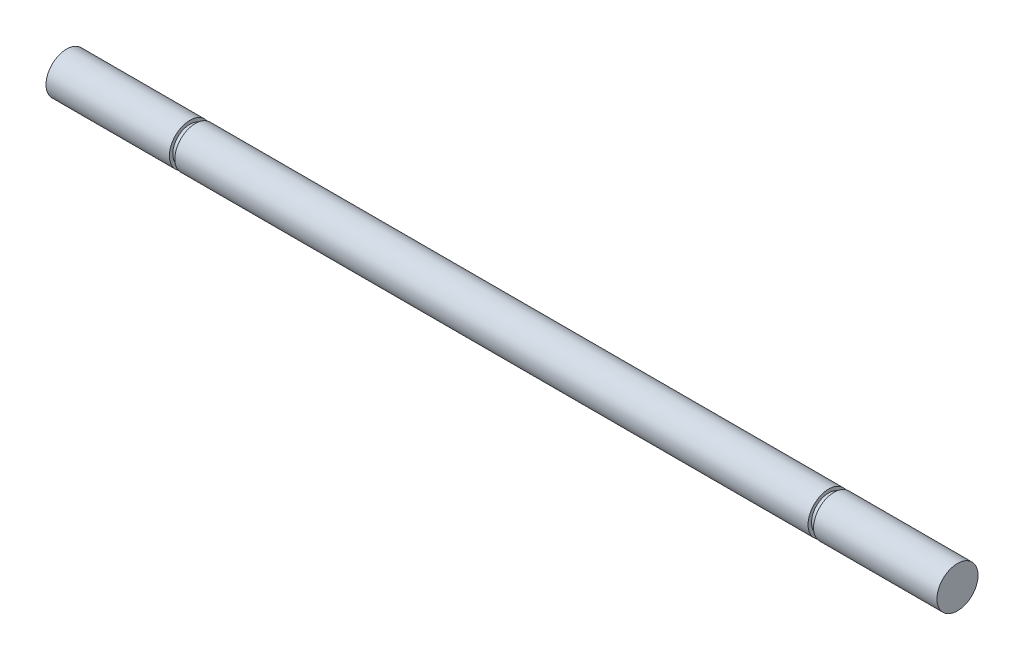
ISO-10303-21;
HEADER;
FILE_DESCRIPTION(('STEP AP214'),'2;1');
FILE_NAME('part.step','',(''),(''),'','','');
FILE_SCHEMA(('AUTOMOTIVE_DESIGN { 1 0 10303 214 1 1 1 1 }'));
ENDSEC;
DATA;
#1=APPLICATION_CONTEXT('core data for automotive mechanical design processes');
#2=APPLICATION_PROTOCOL_DEFINITION('international standard','automotive_design',2000,#1);
#3=PRODUCT_CONTEXT('',#1,'mechanical');
#4=PRODUCT('Part','Part','',(#3));
#5=PRODUCT_RELATED_PRODUCT_CATEGORY('part','',(#4));
#6=PRODUCT_DEFINITION_FORMATION('','',#4);
#7=PRODUCT_DEFINITION_CONTEXT('part definition',#1,'design');
#8=PRODUCT_DEFINITION('design','',#6,#7);
#9=PRODUCT_DEFINITION_SHAPE('','',#8);
#10=(LENGTH_UNIT() NAMED_UNIT(*) SI_UNIT(.MILLI.,.METRE.));
#11=(NAMED_UNIT(*) PLANE_ANGLE_UNIT() SI_UNIT($,.RADIAN.));
#12=(NAMED_UNIT(*) SI_UNIT($,.STERADIAN.) SOLID_ANGLE_UNIT());
#13=UNCERTAINTY_MEASURE_WITH_UNIT(LENGTH_MEASURE(1.E-05),#10,'distance_accuracy_value','');
#14=(GEOMETRIC_REPRESENTATION_CONTEXT(3) GLOBAL_UNCERTAINTY_ASSIGNED_CONTEXT((#13)) GLOBAL_UNIT_ASSIGNED_CONTEXT((#10,
#11,#12)) REPRESENTATION_CONTEXT('',''));
#15=CARTESIAN_POINT('',(0.,0.,0.));
#16=DIRECTION('',(0.,0.,1.));
#17=DIRECTION('',(1.,0.,0.));
#18=AXIS2_PLACEMENT_3D('',#15,#16,#17);
#19=CARTESIAN_POINT('',(0.,0.,0.));
#20=DIRECTION('',(-1.,0.,0.));
#21=DIRECTION('',(0.,0.,1.));
#22=AXIS2_PLACEMENT_3D('',#19,#20,#21);
#23=CYLINDRICAL_SURFACE('',#22,3.);
#24=CARTESIAN_POINT('',(111.2,0.,0.));
#25=DIRECTION('',(-1.,0.,0.));
#26=DIRECTION('',(0.,0.,1.));
#27=AXIS2_PLACEMENT_3D('',#24,#25,#26);
#28=CIRCLE('',#27,3.);
#29=CARTESIAN_POINT('',(111.2,0.,3.));
#30=VERTEX_POINT('',#29);
#31=EDGE_CURVE('E10',#30,#30,#28,.T.);
#32=ORIENTED_EDGE('',*,*,#31,.T.);
#33=EDGE_LOOP('',(#32));
#34=FACE_BOUND('',#33,.T.);
#35=CARTESIAN_POINT('',(18.8,0.,0.));
#36=DIRECTION('',(-1.,0.,0.));
#37=DIRECTION('',(0.,0.,1.));
#38=AXIS2_PLACEMENT_3D('',#35,#36,#37);
#39=CIRCLE('',#38,3.);
#40=CARTESIAN_POINT('',(18.8,0.,3.));
#41=VERTEX_POINT('',#40);
#42=EDGE_CURVE('E67',#41,#41,#39,.T.);
#43=ORIENTED_EDGE('',*,*,#42,.F.);
#44=EDGE_LOOP('',(#43));
#45=FACE_BOUND('',#44,.T.);
#46=ADVANCED_FACE('F33',(#34,#45),#23,.T.);
#47=CARTESIAN_POINT('',(111.2,0.,0.));
#48=DIRECTION('',(1.,0.,0.));
#49=DIRECTION('',(0.,0.,-1.));
#50=AXIS2_PLACEMENT_3D('',#47,#48,#49);
#51=PLANE('',#50);
#52=CARTESIAN_POINT('',(111.2,0.,0.));
#53=DIRECTION('',(-1.,0.,0.));
#54=DIRECTION('',(0.,0.,1.));
#55=AXIS2_PLACEMENT_3D('',#52,#53,#54);
#56=CIRCLE('',#55,2.5);
#57=CARTESIAN_POINT('',(111.2,0.,2.5));
#58=VERTEX_POINT('',#57);
#59=EDGE_CURVE('E39',#58,#58,#56,.T.);
#60=ORIENTED_EDGE('',*,*,#59,.T.);
#61=EDGE_LOOP('',(#60));
#62=FACE_BOUND('',#61,.T.);
#63=ORIENTED_EDGE('',*,*,#31,.F.);
#64=EDGE_LOOP('',(#63));
#65=FACE_BOUND('',#64,.T.);
#66=ADVANCED_FACE('F75',(#62,#65),#51,.T.);
#67=CARTESIAN_POINT('',(0.,0.,0.));
#68=DIRECTION('',(-1.,0.,0.));
#69=DIRECTION('',(0.,0.,1.));
#70=AXIS2_PLACEMENT_3D('',#67,#68,#69);
#71=CYLINDRICAL_SURFACE('',#70,2.5);
#72=ORIENTED_EDGE('',*,*,#59,.F.);
#73=EDGE_LOOP('',(#72));
#74=FACE_BOUND('',#73,.T.);
#75=CARTESIAN_POINT('',(112.,0.,0.));
#76=DIRECTION('',(-1.,0.,0.));
#77=DIRECTION('',(0.,0.,1.));
#78=AXIS2_PLACEMENT_3D('',#75,#76,#77);
#79=CIRCLE('',#78,2.5);
#80=CARTESIAN_POINT('',(112.,0.,2.5));
#81=VERTEX_POINT('',#80);
#82=EDGE_CURVE('E43',#81,#81,#79,.T.);
#83=ORIENTED_EDGE('',*,*,#82,.T.);
#84=EDGE_LOOP('',(#83));
#85=FACE_BOUND('',#84,.T.);
#86=ADVANCED_FACE('F79',(#74,#85),#71,.T.);
#87=CARTESIAN_POINT('',(112.,0.,0.));
#88=DIRECTION('',(1.,0.,0.));
#89=DIRECTION('',(0.,0.,-1.));
#90=AXIS2_PLACEMENT_3D('',#87,#88,#89);
#91=PLANE('',#90);
#92=ORIENTED_EDGE('',*,*,#82,.F.);
#93=EDGE_LOOP('',(#92));
#94=FACE_BOUND('',#93,.T.);
#95=CARTESIAN_POINT('',(112.,0.,0.));
#96=DIRECTION('',(-1.,0.,0.));
#97=DIRECTION('',(0.,0.,1.));
#98=AXIS2_PLACEMENT_3D('',#95,#96,#97);
#99=CIRCLE('',#98,3.);
#100=CARTESIAN_POINT('',(112.,0.,3.));
#101=VERTEX_POINT('',#100);
#102=EDGE_CURVE('E47',#101,#101,#99,.T.);
#103=ORIENTED_EDGE('',*,*,#102,.T.);
#104=EDGE_LOOP('',(#103));
#105=FACE_BOUND('',#104,.T.);
#106=ADVANCED_FACE('F83',(#94,#105),#91,.F.);
#107=CARTESIAN_POINT('',(0.,0.,0.));
#108=DIRECTION('',(-1.,0.,0.));
#109=DIRECTION('',(0.,0.,1.));
#110=AXIS2_PLACEMENT_3D('',#107,#108,#109);
#111=CYLINDRICAL_SURFACE('',#110,3.);
#112=ORIENTED_EDGE('',*,*,#102,.F.);
#113=EDGE_LOOP('',(#112));
#114=FACE_BOUND('',#113,.T.);
#115=CARTESIAN_POINT('',(130.,0.,0.));
#116=DIRECTION('',(-1.,0.,0.));
#117=DIRECTION('',(0.,0.,1.));
#118=AXIS2_PLACEMENT_3D('',#115,#116,#117);
#119=CIRCLE('',#118,3.);
#120=CARTESIAN_POINT('',(130.,0.,3.));
#121=VERTEX_POINT('',#120);
#122=EDGE_CURVE('E52',#121,#121,#119,.T.);
#123=ORIENTED_EDGE('',*,*,#122,.T.);
#124=EDGE_LOOP('',(#123));
#125=FACE_BOUND('',#124,.T.);
#126=ADVANCED_FACE('F90',(#114,#125),#111,.T.);
#127=CARTESIAN_POINT('',(130.,0.,0.));
#128=DIRECTION('',(-1.,0.,0.));
#129=DIRECTION('',(0.,0.,1.));
#130=AXIS2_PLACEMENT_3D('',#127,#128,#129);
#131=PLANE('',#130);
#132=ORIENTED_EDGE('',*,*,#122,.F.);
#133=EDGE_LOOP('',(#132));
#134=FACE_BOUND('',#133,.T.);
#135=ADVANCED_FACE('F94',(#134),#131,.F.);
#136=CARTESIAN_POINT('',(0.,0.,0.));
#137=DIRECTION('',(-1.,0.,0.));
#138=DIRECTION('',(0.,0.,1.));
#139=AXIS2_PLACEMENT_3D('',#136,#137,#138);
#140=PLANE('',#139);
#141=CARTESIAN_POINT('',(0.,0.,0.));
#142=DIRECTION('',(-1.,0.,0.));
#143=DIRECTION('',(0.,0.,1.));
#144=AXIS2_PLACEMENT_3D('',#141,#142,#143);
#145=CIRCLE('',#144,3.);
#146=CARTESIAN_POINT('',(0.,0.,3.));
#147=VERTEX_POINT('',#146);
#148=EDGE_CURVE('E55',#147,#147,#145,.T.);
#149=ORIENTED_EDGE('',*,*,#148,.T.);
#150=EDGE_LOOP('',(#149));
#151=FACE_BOUND('',#150,.T.);
#152=ADVANCED_FACE('F98',(#151),#140,.T.);
#153=CARTESIAN_POINT('',(0.,0.,0.));
#154=DIRECTION('',(-1.,0.,0.));
#155=DIRECTION('',(0.,0.,1.));
#156=AXIS2_PLACEMENT_3D('',#153,#154,#155);
#157=CYLINDRICAL_SURFACE('',#156,3.);
#158=CARTESIAN_POINT('',(18.,0.,0.));
#159=DIRECTION('',(-1.,0.,0.));
#160=DIRECTION('',(0.,0.,1.));
#161=AXIS2_PLACEMENT_3D('',#158,#159,#160);
#162=CIRCLE('',#161,3.);
#163=CARTESIAN_POINT('',(18.,0.,3.));
#164=VERTEX_POINT('',#163);
#165=EDGE_CURVE('E58',#164,#164,#162,.T.);
#166=ORIENTED_EDGE('',*,*,#165,.T.);
#167=EDGE_LOOP('',(#166));
#168=FACE_BOUND('',#167,.T.);
#169=ORIENTED_EDGE('',*,*,#148,.F.);
#170=EDGE_LOOP('',(#169));
#171=FACE_BOUND('',#170,.T.);
#172=ADVANCED_FACE('F102',(#168,#171),#157,.T.);
#173=CARTESIAN_POINT('',(18.,0.,0.));
#174=DIRECTION('',(-1.,0.,0.));
#175=DIRECTION('',(0.,0.,1.));
#176=AXIS2_PLACEMENT_3D('',#173,#174,#175);
#177=PLANE('',#176);
#178=ORIENTED_EDGE('',*,*,#165,.F.);
#179=EDGE_LOOP('',(#178));
#180=FACE_BOUND('',#179,.T.);
#181=CARTESIAN_POINT('',(18.,0.,0.));
#182=DIRECTION('',(-1.,0.,0.));
#183=DIRECTION('',(0.,0.,1.));
#184=AXIS2_PLACEMENT_3D('',#181,#182,#183);
#185=CIRCLE('',#184,2.5);
#186=CARTESIAN_POINT('',(18.,0.,2.5));
#187=VERTEX_POINT('',#186);
#188=EDGE_CURVE('E61',#187,#187,#185,.T.);
#189=ORIENTED_EDGE('',*,*,#188,.T.);
#190=EDGE_LOOP('',(#189));
#191=FACE_BOUND('',#190,.T.);
#192=ADVANCED_FACE('F106',(#180,#191),#177,.F.);
#193=CARTESIAN_POINT('',(0.,0.,0.));
#194=DIRECTION('',(-1.,0.,0.));
#195=DIRECTION('',(0.,0.,1.));
#196=AXIS2_PLACEMENT_3D('',#193,#194,#195);
#197=CYLINDRICAL_SURFACE('',#196,2.5);
#198=ORIENTED_EDGE('',*,*,#188,.F.);
#199=EDGE_LOOP('',(#198));
#200=FACE_BOUND('',#199,.T.);
#201=CARTESIAN_POINT('',(18.8,0.,0.));
#202=DIRECTION('',(-1.,0.,0.));
#203=DIRECTION('',(0.,0.,1.));
#204=AXIS2_PLACEMENT_3D('',#201,#202,#203);
#205=CIRCLE('',#204,2.5);
#206=CARTESIAN_POINT('',(18.8,0.,2.5));
#207=VERTEX_POINT('',#206);
#208=EDGE_CURVE('E64',#207,#207,#205,.T.);
#209=ORIENTED_EDGE('',*,*,#208,.T.);
#210=EDGE_LOOP('',(#209));
#211=FACE_BOUND('',#210,.T.);
#212=ADVANCED_FACE('F110',(#200,#211),#197,.T.);
#213=CARTESIAN_POINT('',(18.8,0.,0.));
#214=DIRECTION('',(-1.,0.,0.));
#215=DIRECTION('',(0.,0.,1.));
#216=AXIS2_PLACEMENT_3D('',#213,#214,#215);
#217=PLANE('',#216);
#218=ORIENTED_EDGE('',*,*,#42,.T.);
#219=EDGE_LOOP('',(#218));
#220=FACE_BOUND('',#219,.T.);
#221=ORIENTED_EDGE('',*,*,#208,.F.);
#222=EDGE_LOOP('',(#221));
#223=FACE_BOUND('',#222,.T.);
#224=ADVANCED_FACE('F71',(#220,#223),#217,.T.);
#225=CLOSED_SHELL('',(#46,#66,#86,#106,#126,#135,#152,#172,#192,#212,#224));
#226=MANIFOLD_SOLID_BREP('B2',#225);
#227=ADVANCED_BREP_SHAPE_REPRESENTATION('',(#18,#226),#14);
#228=SHAPE_DEFINITION_REPRESENTATION(#9,#227);
ENDSEC;
END-ISO-10303-21;
